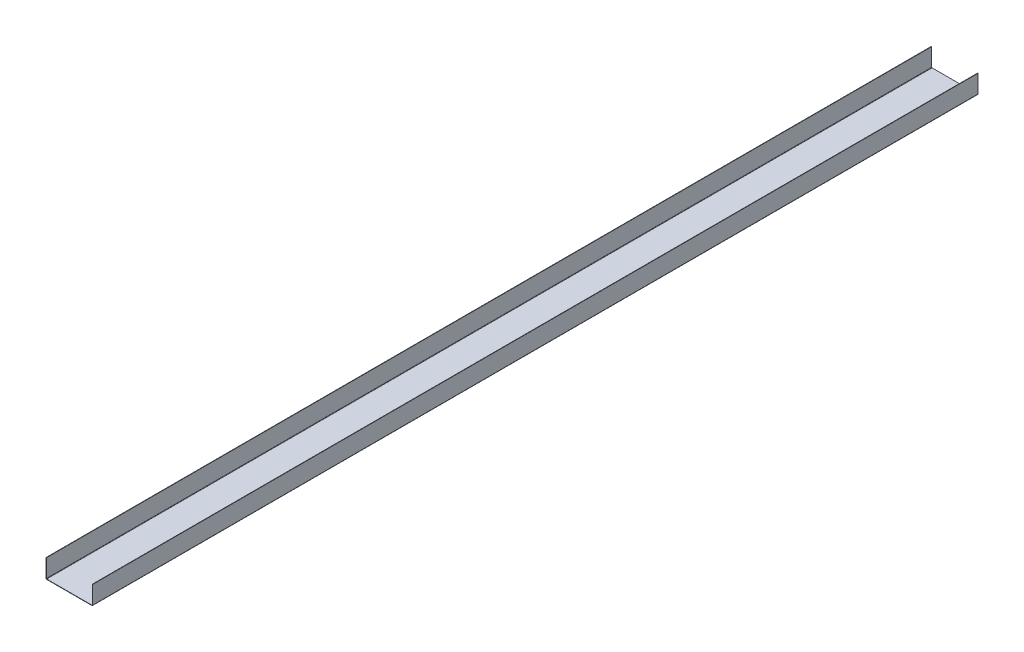
ISO-10303-21;
HEADER;
FILE_DESCRIPTION(('STEP AP214'),'2;1');
FILE_NAME('part.step','',(''),(''),'','','');
FILE_SCHEMA(('AUTOMOTIVE_DESIGN { 1 0 10303 214 1 1 1 1 }'));
ENDSEC;
DATA;
#1=APPLICATION_CONTEXT('core data for automotive mechanical design processes');
#2=APPLICATION_PROTOCOL_DEFINITION('international standard','automotive_design',2000,#1);
#3=PRODUCT_CONTEXT('',#1,'mechanical');
#4=PRODUCT('Part','Part','',(#3));
#5=PRODUCT_RELATED_PRODUCT_CATEGORY('part','',(#4));
#6=PRODUCT_DEFINITION_FORMATION('','',#4);
#7=PRODUCT_DEFINITION_CONTEXT('part definition',#1,'design');
#8=PRODUCT_DEFINITION('design','',#6,#7);
#9=PRODUCT_DEFINITION_SHAPE('','',#8);
#10=(LENGTH_UNIT() NAMED_UNIT(*) SI_UNIT(.MILLI.,.METRE.));
#11=(NAMED_UNIT(*) PLANE_ANGLE_UNIT() SI_UNIT($,.RADIAN.));
#12=(NAMED_UNIT(*) SI_UNIT($,.STERADIAN.) SOLID_ANGLE_UNIT());
#13=UNCERTAINTY_MEASURE_WITH_UNIT(LENGTH_MEASURE(1.E-05),#10,'distance_accuracy_value','');
#14=(GEOMETRIC_REPRESENTATION_CONTEXT(3) GLOBAL_UNCERTAINTY_ASSIGNED_CONTEXT((#13)) GLOBAL_UNIT_ASSIGNED_CONTEXT((#10,
#11,#12)) REPRESENTATION_CONTEXT('',''));
#15=CARTESIAN_POINT('',(0.,0.,0.));
#16=DIRECTION('',(0.,0.,1.));
#17=DIRECTION('',(1.,0.,0.));
#18=AXIS2_PLACEMENT_3D('',#15,#16,#17);
#19=CARTESIAN_POINT('',(-50.,1.5,1900.));
#20=DIRECTION('',(0.,0.,1.));
#21=DIRECTION('',(1.,0.,0.));
#22=AXIS2_PLACEMENT_3D('',#19,#20,#21);
#23=PLANE('',#22);
#24=DIRECTION('',(1.,0.,0.));
#25=VECTOR('',#24,1.);
#26=CARTESIAN_POINT('',(-50.,1.5,1900.));
#27=LINE('',#26,#25);
#28=CARTESIAN_POINT('',(-50.,1.5,1900.));
#29=VERTEX_POINT('',#28);
#30=CARTESIAN_POINT('',(-49.25,1.5,1900.));
#31=VERTEX_POINT('',#30);
#32=EDGE_CURVE('E11',#29,#31,#27,.T.);
#33=ORIENTED_EDGE('',*,*,#32,.F.);
#34=CARTESIAN_POINT('',(-48.5,1.5,1900.));
#35=DIRECTION('',(0.,0.,-1.));
#36=DIRECTION('',(-1.,0.,0.));
#37=AXIS2_PLACEMENT_3D('',#34,#35,#36);
#38=CIRCLE('',#37,1.5);
#39=CARTESIAN_POINT('',(-48.5,0.,1900.));
#40=VERTEX_POINT('',#39);
#41=EDGE_CURVE('E149',#29,#40,#38,.F.);
#42=ORIENTED_EDGE('',*,*,#41,.T.);
#43=DIRECTION('',(0.,-1.,0.));
#44=VECTOR('',#43,1.);
#45=CARTESIAN_POINT('',(-48.5,0.75,1900.));
#46=LINE('',#45,#44);
#47=CARTESIAN_POINT('',(-48.5,0.75,1900.));
#48=VERTEX_POINT('',#47);
#49=EDGE_CURVE('E47',#48,#40,#46,.T.);
#50=ORIENTED_EDGE('',*,*,#49,.F.);
#51=CARTESIAN_POINT('',(-48.5,1.5,1900.));
#52=DIRECTION('',(0.,0.,1.));
#53=DIRECTION('',(1.,0.,0.));
#54=AXIS2_PLACEMENT_3D('',#51,#52,#53);
#55=CIRCLE('',#54,0.75);
#56=EDGE_CURVE('E243',#31,#48,#55,.T.);
#57=ORIENTED_EDGE('',*,*,#56,.F.);
#58=EDGE_LOOP('',(#33,#42,#50,#57));
#59=FACE_BOUND('',#58,.T.);
#60=ADVANCED_FACE('F39',(#59),#23,.T.);
#61=CARTESIAN_POINT('',(-48.5,0.75,1900.));
#62=DIRECTION('',(0.,0.,1.));
#63=DIRECTION('',(1.,0.,0.));
#64=AXIS2_PLACEMENT_3D('',#61,#62,#63);
#65=PLANE('',#64);
#66=DIRECTION('',(0.,-1.,0.));
#67=VECTOR('',#66,1.);
#68=CARTESIAN_POINT('',(-50.,40.,1900.));
#69=LINE('',#68,#67);
#70=CARTESIAN_POINT('',(-50.,40.,1900.));
#71=VERTEX_POINT('',#70);
#72=EDGE_CURVE('E154',#71,#29,#69,.T.);
#73=ORIENTED_EDGE('',*,*,#72,.T.);
#74=ORIENTED_EDGE('',*,*,#32,.T.);
#75=DIRECTION('',(0.,-1.,0.));
#76=VECTOR('',#75,1.);
#77=CARTESIAN_POINT('',(-49.25,40.,1900.));
#78=LINE('',#77,#76);
#79=CARTESIAN_POINT('',(-49.25,40.,1900.));
#80=VERTEX_POINT('',#79);
#81=EDGE_CURVE('E256',#80,#31,#78,.T.);
#82=ORIENTED_EDGE('',*,*,#81,.F.);
#83=DIRECTION('',(1.,0.,0.));
#84=VECTOR('',#83,1.);
#85=CARTESIAN_POINT('',(-50.,40.,1900.));
#86=LINE('',#85,#84);
#87=EDGE_CURVE('E258',#71,#80,#86,.T.);
#88=ORIENTED_EDGE('',*,*,#87,.F.);
#89=EDGE_LOOP('',(#73,#74,#82,#88));
#90=FACE_BOUND('',#89,.T.);
#91=ADVANCED_FACE('F269',(#90),#65,.T.);
#92=CARTESIAN_POINT('',(-48.5,0.,0.));
#93=DIRECTION('',(0.,0.,-1.));
#94=DIRECTION('',(-1.,0.,0.));
#95=AXIS2_PLACEMENT_3D('',#92,#93,#94);
#96=PLANE('',#95);
#97=DIRECTION('',(0.,1.,0.));
#98=VECTOR('',#97,1.);
#99=CARTESIAN_POINT('',(-48.5,0.,0.));
#100=LINE('',#99,#98);
#101=CARTESIAN_POINT('',(-48.5,0.,0.));
#102=VERTEX_POINT('',#101);
#103=CARTESIAN_POINT('',(-48.5,0.75,0.));
#104=VERTEX_POINT('',#103);
#105=EDGE_CURVE('E147',#102,#104,#100,.T.);
#106=ORIENTED_EDGE('',*,*,#105,.F.);
#107=CARTESIAN_POINT('',(-48.5,1.5,0.));
#108=DIRECTION('',(0.,0.,-1.));
#109=DIRECTION('',(-1.,0.,0.));
#110=AXIS2_PLACEMENT_3D('',#107,#108,#109);
#111=CIRCLE('',#110,1.5);
#112=CARTESIAN_POINT('',(-50.,1.5,0.));
#113=VERTEX_POINT('',#112);
#114=EDGE_CURVE('E161',#113,#102,#111,.F.);
#115=ORIENTED_EDGE('',*,*,#114,.F.);
#116=DIRECTION('',(-1.,0.,0.));
#117=VECTOR('',#116,1.);
#118=CARTESIAN_POINT('',(-49.25,1.5,0.));
#119=LINE('',#118,#117);
#120=CARTESIAN_POINT('',(-49.25,1.5,0.));
#121=VERTEX_POINT('',#120);
#122=EDGE_CURVE('E234',#121,#113,#119,.T.);
#123=ORIENTED_EDGE('',*,*,#122,.F.);
#124=CARTESIAN_POINT('',(-48.5,1.5,0.));
#125=DIRECTION('',(0.,0.,1.));
#126=DIRECTION('',(1.,0.,0.));
#127=AXIS2_PLACEMENT_3D('',#124,#125,#126);
#128=CIRCLE('',#127,0.75);
#129=EDGE_CURVE('E188',#121,#104,#128,.T.);
#130=ORIENTED_EDGE('',*,*,#129,.T.);
#131=EDGE_LOOP('',(#106,#115,#123,#130));
#132=FACE_BOUND('',#131,.T.);
#133=ADVANCED_FACE('F248',(#132),#96,.T.);
#134=CARTESIAN_POINT('',(-49.25,1.5,0.));
#135=DIRECTION('',(0.,0.,-1.));
#136=DIRECTION('',(-1.,0.,0.));
#137=AXIS2_PLACEMENT_3D('',#134,#135,#136);
#138=PLANE('',#137);
#139=DIRECTION('',(1.,0.,0.));
#140=VECTOR('',#139,1.);
#141=CARTESIAN_POINT('',(-50.,0.,0.));
#142=LINE('',#141,#140);
#143=CARTESIAN_POINT('',(48.5,0.,0.));
#144=VERTEX_POINT('',#143);
#145=EDGE_CURVE('E201',#102,#144,#142,.T.);
#146=ORIENTED_EDGE('',*,*,#145,.F.);
#147=ORIENTED_EDGE('',*,*,#105,.T.);
#148=DIRECTION('',(1.,0.,0.));
#149=VECTOR('',#148,1.);
#150=CARTESIAN_POINT('',(-50.,0.75,0.));
#151=LINE('',#150,#149);
#152=CARTESIAN_POINT('',(48.5,0.750000000000018,0.));
#153=VERTEX_POINT('',#152);
#154=EDGE_CURVE('E186',#104,#153,#151,.T.);
#155=ORIENTED_EDGE('',*,*,#154,.T.);
#156=DIRECTION('',(0.,-1.,0.));
#157=VECTOR('',#156,1.);
#158=CARTESIAN_POINT('',(48.5,0.750000000000018,0.));
#159=LINE('',#158,#157);
#160=EDGE_CURVE('E96',#153,#144,#159,.T.);
#161=ORIENTED_EDGE('',*,*,#160,.T.);
#162=EDGE_LOOP('',(#146,#147,#155,#161));
#163=FACE_BOUND('',#162,.T.);
#164=ADVANCED_FACE('F236',(#163),#138,.T.);
#165=CARTESIAN_POINT('',(48.5,0.,1900.));
#166=DIRECTION('',(0.,0.,1.));
#167=DIRECTION('',(1.,0.,0.));
#168=AXIS2_PLACEMENT_3D('',#165,#166,#167);
#169=PLANE('',#168);
#170=DIRECTION('',(0.,1.,0.));
#171=VECTOR('',#170,1.);
#172=CARTESIAN_POINT('',(48.5,0.,1900.));
#173=LINE('',#172,#171);
#174=CARTESIAN_POINT('',(48.5,0.,1900.));
#175=VERTEX_POINT('',#174);
#176=CARTESIAN_POINT('',(48.5,0.750000000000018,1900.));
#177=VERTEX_POINT('',#176);
#178=EDGE_CURVE('E232',#175,#177,#173,.T.);
#179=ORIENTED_EDGE('',*,*,#178,.F.);
#180=CARTESIAN_POINT('',(48.5,1.50000000000002,1900.));
#181=DIRECTION('',(0.,0.,-1.));
#182=DIRECTION('',(-1.,0.,0.));
#183=AXIS2_PLACEMENT_3D('',#180,#181,#182);
#184=CIRCLE('',#183,1.5);
#185=CARTESIAN_POINT('',(50.,1.50000000000002,1900.));
#186=VERTEX_POINT('',#185);
#187=EDGE_CURVE('E169',#175,#186,#184,.F.);
#188=ORIENTED_EDGE('',*,*,#187,.T.);
#189=DIRECTION('',(1.,0.,0.));
#190=VECTOR('',#189,1.);
#191=CARTESIAN_POINT('',(49.25,1.50000000000002,1900.));
#192=LINE('',#191,#190);
#193=CARTESIAN_POINT('',(49.25,1.50000000000002,1900.));
#194=VERTEX_POINT('',#193);
#195=EDGE_CURVE('E55',#194,#186,#192,.T.);
#196=ORIENTED_EDGE('',*,*,#195,.F.);
#197=CARTESIAN_POINT('',(48.5,1.50000000000002,1900.));
#198=DIRECTION('',(0.,0.,1.));
#199=DIRECTION('',(1.,0.,0.));
#200=AXIS2_PLACEMENT_3D('',#197,#198,#199);
#201=CIRCLE('',#200,0.75);
#202=EDGE_CURVE('E260',#177,#194,#201,.T.);
#203=ORIENTED_EDGE('',*,*,#202,.F.);
#204=EDGE_LOOP('',(#179,#188,#196,#203));
#205=FACE_BOUND('',#204,.T.);
#206=ADVANCED_FACE('F295',(#205),#169,.T.);
#207=CARTESIAN_POINT('',(49.25,1.50000000000002,1900.));
#208=DIRECTION('',(0.,0.,1.));
#209=DIRECTION('',(1.,0.,0.));
#210=AXIS2_PLACEMENT_3D('',#207,#208,#209);
#211=PLANE('',#210);
#212=DIRECTION('',(1.,0.,0.));
#213=VECTOR('',#212,1.);
#214=CARTESIAN_POINT('',(-50.,0.,1900.));
#215=LINE('',#214,#213);
#216=EDGE_CURVE('E139',#40,#175,#215,.T.);
#217=ORIENTED_EDGE('',*,*,#216,.T.);
#218=ORIENTED_EDGE('',*,*,#178,.T.);
#219=DIRECTION('',(1.,0.,0.));
#220=VECTOR('',#219,1.);
#221=CARTESIAN_POINT('',(-50.,0.75,1900.));
#222=LINE('',#221,#220);
#223=EDGE_CURVE('E142',#48,#177,#222,.T.);
#224=ORIENTED_EDGE('',*,*,#223,.F.);
#225=ORIENTED_EDGE('',*,*,#49,.T.);
#226=EDGE_LOOP('',(#217,#218,#224,#225));
#227=FACE_BOUND('',#226,.T.);
#228=ADVANCED_FACE('F137',(#227),#211,.T.);
#229=CARTESIAN_POINT('',(50.,1.50000000000002,0.));
#230=DIRECTION('',(0.,0.,-1.));
#231=DIRECTION('',(-1.,0.,0.));
#232=AXIS2_PLACEMENT_3D('',#229,#230,#231);
#233=PLANE('',#232);
#234=DIRECTION('',(-1.,0.,0.));
#235=VECTOR('',#234,1.);
#236=CARTESIAN_POINT('',(50.,1.50000000000002,0.));
#237=LINE('',#236,#235);
#238=CARTESIAN_POINT('',(50.,1.50000000000002,0.));
#239=VERTEX_POINT('',#238);
#240=CARTESIAN_POINT('',(49.25,1.50000000000002,0.));
#241=VERTEX_POINT('',#240);
#242=EDGE_CURVE('E103',#239,#241,#237,.T.);
#243=ORIENTED_EDGE('',*,*,#242,.F.);
#244=CARTESIAN_POINT('',(48.5,1.50000000000002,0.));
#245=DIRECTION('',(0.,0.,-1.));
#246=DIRECTION('',(-1.,0.,0.));
#247=AXIS2_PLACEMENT_3D('',#244,#245,#246);
#248=CIRCLE('',#247,1.5);
#249=EDGE_CURVE('E203',#144,#239,#248,.F.);
#250=ORIENTED_EDGE('',*,*,#249,.F.);
#251=ORIENTED_EDGE('',*,*,#160,.F.);
#252=CARTESIAN_POINT('',(48.5,1.50000000000002,0.));
#253=DIRECTION('',(0.,0.,1.));
#254=DIRECTION('',(1.,0.,0.));
#255=AXIS2_PLACEMENT_3D('',#252,#253,#254);
#256=CIRCLE('',#255,0.75);
#257=EDGE_CURVE('E184',#153,#241,#256,.T.);
#258=ORIENTED_EDGE('',*,*,#257,.T.);
#259=EDGE_LOOP('',(#243,#250,#251,#258));
#260=FACE_BOUND('',#259,.T.);
#261=ADVANCED_FACE('F301',(#260),#233,.T.);
#262=CARTESIAN_POINT('',(48.5,0.750000000000018,0.));
#263=DIRECTION('',(0.,0.,-1.));
#264=DIRECTION('',(-1.,0.,0.));
#265=AXIS2_PLACEMENT_3D('',#262,#263,#264);
#266=PLANE('',#265);
#267=DIRECTION('',(0.,1.,0.));
#268=VECTOR('',#267,1.);
#269=CARTESIAN_POINT('',(50.,0.,0.));
#270=LINE('',#269,#268);
#271=CARTESIAN_POINT('',(50.,40.,0.));
#272=VERTEX_POINT('',#271);
#273=EDGE_CURVE('E175',#239,#272,#270,.T.);
#274=ORIENTED_EDGE('',*,*,#273,.F.);
#275=ORIENTED_EDGE('',*,*,#242,.T.);
#276=DIRECTION('',(0.,1.,0.));
#277=VECTOR('',#276,1.);
#278=CARTESIAN_POINT('',(49.25,0.,0.));
#279=LINE('',#278,#277);
#280=CARTESIAN_POINT('',(49.25,40.,0.));
#281=VERTEX_POINT('',#280);
#282=EDGE_CURVE('E181',#241,#281,#279,.T.);
#283=ORIENTED_EDGE('',*,*,#282,.T.);
#284=DIRECTION('',(1.,0.,0.));
#285=VECTOR('',#284,1.);
#286=CARTESIAN_POINT('',(49.25,40.,0.));
#287=LINE('',#286,#285);
#288=EDGE_CURVE('E178',#281,#272,#287,.T.);
#289=ORIENTED_EDGE('',*,*,#288,.T.);
#290=EDGE_LOOP('',(#274,#275,#283,#289));
#291=FACE_BOUND('',#290,.T.);
#292=ADVANCED_FACE('F304',(#291),#266,.T.);
#293=CARTESIAN_POINT('',(50.,0.,1900.));
#294=DIRECTION('',(-1.,0.,0.));
#295=DIRECTION('',(0.,-1.,0.));
#296=AXIS2_PLACEMENT_3D('',#293,#294,#295);
#297=PLANE('',#296);
#298=ORIENTED_EDGE('',*,*,#273,.T.);
#299=DIRECTION('',(0.,0.,-1.));
#300=VECTOR('',#299,1.);
#301=CARTESIAN_POINT('',(50.,40.,1900.));
#302=LINE('',#301,#300);
#303=CARTESIAN_POINT('',(50.,40.,1900.));
#304=VERTEX_POINT('',#303);
#305=EDGE_CURVE('E227',#304,#272,#302,.T.);
#306=ORIENTED_EDGE('',*,*,#305,.F.);
#307=DIRECTION('',(0.,1.,0.));
#308=VECTOR('',#307,1.);
#309=CARTESIAN_POINT('',(50.,0.,1900.));
#310=LINE('',#309,#308);
#311=EDGE_CURVE('E109',#186,#304,#310,.T.);
#312=ORIENTED_EDGE('',*,*,#311,.F.);
#313=DIRECTION('',(0.,0.,-1.));
#314=VECTOR('',#313,1.);
#315=CARTESIAN_POINT('',(50.,1.50000000000002,1900.));
#316=LINE('',#315,#314);
#317=EDGE_CURVE('E171',#186,#239,#316,.T.);
#318=ORIENTED_EDGE('',*,*,#317,.T.);
#319=EDGE_LOOP('',(#298,#306,#312,#318));
#320=FACE_BOUND('',#319,.T.);
#321=ADVANCED_FACE('F307',(#320),#297,.F.);
#322=CARTESIAN_POINT('',(49.25,40.,1900.));
#323=DIRECTION('',(0.,1.,0.));
#324=DIRECTION('',(0.,0.,1.));
#325=AXIS2_PLACEMENT_3D('',#322,#323,#324);
#326=PLANE('',#325);
#327=ORIENTED_EDGE('',*,*,#288,.F.);
#328=DIRECTION('',(0.,0.,-1.));
#329=VECTOR('',#328,1.);
#330=CARTESIAN_POINT('',(49.25,40.,1900.));
#331=LINE('',#330,#329);
#332=CARTESIAN_POINT('',(49.25,40.,1900.));
#333=VERTEX_POINT('',#332);
#334=EDGE_CURVE('E225',#333,#281,#331,.T.);
#335=ORIENTED_EDGE('',*,*,#334,.F.);
#336=DIRECTION('',(1.,0.,0.));
#337=VECTOR('',#336,1.);
#338=CARTESIAN_POINT('',(49.25,40.,1900.));
#339=LINE('',#338,#337);
#340=EDGE_CURVE('E515',#333,#304,#339,.T.);
#341=ORIENTED_EDGE('',*,*,#340,.T.);
#342=ORIENTED_EDGE('',*,*,#305,.T.);
#343=EDGE_LOOP('',(#327,#335,#341,#342));
#344=FACE_BOUND('',#343,.T.);
#345=ADVANCED_FACE('F311',(#344),#326,.T.);
#346=CARTESIAN_POINT('',(49.25,0.,1900.));
#347=DIRECTION('',(-1.,0.,0.));
#348=DIRECTION('',(0.,-1.,0.));
#349=AXIS2_PLACEMENT_3D('',#346,#347,#348);
#350=PLANE('',#349);
#351=ORIENTED_EDGE('',*,*,#282,.F.);
#352=DIRECTION('',(0.,0.,-1.));
#353=VECTOR('',#352,1.);
#354=CARTESIAN_POINT('',(49.25,1.50000000000002,1900.));
#355=LINE('',#354,#353);
#356=EDGE_CURVE('E222',#194,#241,#355,.T.);
#357=ORIENTED_EDGE('',*,*,#356,.F.);
#358=DIRECTION('',(0.,1.,0.));
#359=VECTOR('',#358,1.);
#360=CARTESIAN_POINT('',(49.25,0.,1900.));
#361=LINE('',#360,#359);
#362=EDGE_CURVE('E517',#194,#333,#361,.T.);
#363=ORIENTED_EDGE('',*,*,#362,.T.);
#364=ORIENTED_EDGE('',*,*,#334,.T.);
#365=EDGE_LOOP('',(#351,#357,#363,#364));
#366=FACE_BOUND('',#365,.T.);
#367=ADVANCED_FACE('F315',(#366),#350,.T.);
#368=CARTESIAN_POINT('',(48.5,1.50000000000002,1900.));
#369=DIRECTION('',(0.,0.,-1.));
#370=DIRECTION('',(-1.,0.,0.));
#371=AXIS2_PLACEMENT_3D('',#368,#369,#370);
#372=CYLINDRICAL_SURFACE('',#371,0.75);
#373=ORIENTED_EDGE('',*,*,#257,.F.);
#374=DIRECTION('',(0.,0.,-1.));
#375=VECTOR('',#374,1.);
#376=CARTESIAN_POINT('',(48.5,0.750000000000018,1900.));
#377=LINE('',#376,#375);
#378=EDGE_CURVE('E219',#177,#153,#377,.T.);
#379=ORIENTED_EDGE('',*,*,#378,.F.);
#380=ORIENTED_EDGE('',*,*,#202,.T.);
#381=ORIENTED_EDGE('',*,*,#356,.T.);
#382=EDGE_LOOP('',(#373,#379,#380,#381));
#383=FACE_BOUND('',#382,.T.);
#384=ADVANCED_FACE('F319',(#383),#372,.F.);
#385=CARTESIAN_POINT('',(-50.,0.75,1900.));
#386=DIRECTION('',(0.,1.,0.));
#387=DIRECTION('',(-1.,0.,0.));
#388=AXIS2_PLACEMENT_3D('',#385,#386,#387);
#389=PLANE('',#388);
#390=ORIENTED_EDGE('',*,*,#154,.F.);
#391=DIRECTION('',(0.,0.,-1.));
#392=VECTOR('',#391,1.);
#393=CARTESIAN_POINT('',(-48.5,0.75,1900.));
#394=LINE('',#393,#392);
#395=EDGE_CURVE('E216',#48,#104,#394,.T.);
#396=ORIENTED_EDGE('',*,*,#395,.F.);
#397=ORIENTED_EDGE('',*,*,#223,.T.);
#398=ORIENTED_EDGE('',*,*,#378,.T.);
#399=EDGE_LOOP('',(#390,#396,#397,#398));
#400=FACE_BOUND('',#399,.T.);
#401=ADVANCED_FACE('F245',(#400),#389,.T.);
#402=CARTESIAN_POINT('',(-48.5,1.5,1900.));
#403=DIRECTION('',(0.,0.,-1.));
#404=DIRECTION('',(-1.,0.,0.));
#405=AXIS2_PLACEMENT_3D('',#402,#403,#404);
#406=CYLINDRICAL_SURFACE('',#405,0.75);
#407=ORIENTED_EDGE('',*,*,#129,.F.);
#408=DIRECTION('',(0.,0.,-1.));
#409=VECTOR('',#408,1.);
#410=CARTESIAN_POINT('',(-49.25,1.5,1900.));
#411=LINE('',#410,#409);
#412=EDGE_CURVE('E213',#31,#121,#411,.T.);
#413=ORIENTED_EDGE('',*,*,#412,.F.);
#414=ORIENTED_EDGE('',*,*,#56,.T.);
#415=ORIENTED_EDGE('',*,*,#395,.T.);
#416=EDGE_LOOP('',(#407,#413,#414,#415));
#417=FACE_BOUND('',#416,.T.);
#418=ADVANCED_FACE('F241',(#417),#406,.F.);
#419=CARTESIAN_POINT('',(-49.25,40.,1900.));
#420=DIRECTION('',(1.,0.,0.));
#421=DIRECTION('',(0.,1.,0.));
#422=AXIS2_PLACEMENT_3D('',#419,#420,#421);
#423=PLANE('',#422);
#424=DIRECTION('',(0.,-1.,0.));
#425=VECTOR('',#424,1.);
#426=CARTESIAN_POINT('',(-49.25,40.,0.));
#427=LINE('',#426,#425);
#428=CARTESIAN_POINT('',(-49.25,40.,0.));
#429=VERTEX_POINT('',#428);
#430=EDGE_CURVE('E191',#429,#121,#427,.T.);
#431=ORIENTED_EDGE('',*,*,#430,.F.);
#432=DIRECTION('',(0.,0.,-1.));
#433=VECTOR('',#432,1.);
#434=CARTESIAN_POINT('',(-49.25,40.,1900.));
#435=LINE('',#434,#433);
#436=EDGE_CURVE('E211',#80,#429,#435,.T.);
#437=ORIENTED_EDGE('',*,*,#436,.F.);
#438=ORIENTED_EDGE('',*,*,#81,.T.);
#439=ORIENTED_EDGE('',*,*,#412,.T.);
#440=EDGE_LOOP('',(#431,#437,#438,#439));
#441=FACE_BOUND('',#440,.T.);
#442=ADVANCED_FACE('F254',(#441),#423,.T.);
#443=CARTESIAN_POINT('',(-50.,40.,1900.));
#444=DIRECTION('',(0.,1.,0.));
#445=DIRECTION('',(0.,0.,1.));
#446=AXIS2_PLACEMENT_3D('',#443,#444,#445);
#447=PLANE('',#446);
#448=DIRECTION('',(1.,0.,0.));
#449=VECTOR('',#448,1.);
#450=CARTESIAN_POINT('',(-50.,40.,0.));
#451=LINE('',#450,#449);
#452=CARTESIAN_POINT('',(-50.,40.,0.));
#453=VERTEX_POINT('',#452);
#454=EDGE_CURVE('E194',#453,#429,#451,.T.);
#455=ORIENTED_EDGE('',*,*,#454,.F.);
#456=DIRECTION('',(0.,0.,-1.));
#457=VECTOR('',#456,1.);
#458=CARTESIAN_POINT('',(-50.,40.,1900.));
#459=LINE('',#458,#457);
#460=EDGE_CURVE('E209',#71,#453,#459,.T.);
#461=ORIENTED_EDGE('',*,*,#460,.F.);
#462=ORIENTED_EDGE('',*,*,#87,.T.);
#463=ORIENTED_EDGE('',*,*,#436,.T.);
#464=EDGE_LOOP('',(#455,#461,#462,#463));
#465=FACE_BOUND('',#464,.T.);
#466=ADVANCED_FACE('F275',(#465),#447,.T.);
#467=CARTESIAN_POINT('',(-50.,40.,1900.));
#468=DIRECTION('',(1.,0.,0.));
#469=DIRECTION('',(0.,1.,0.));
#470=AXIS2_PLACEMENT_3D('',#467,#468,#469);
#471=PLANE('',#470);
#472=DIRECTION('',(0.,-1.,0.));
#473=VECTOR('',#472,1.);
#474=CARTESIAN_POINT('',(-50.,40.,0.));
#475=LINE('',#474,#473);
#476=EDGE_CURVE('E197',#453,#113,#475,.T.);
#477=ORIENTED_EDGE('',*,*,#476,.T.);
#478=DIRECTION('',(0.,0.,-1.));
#479=VECTOR('',#478,1.);
#480=CARTESIAN_POINT('',(-50.,1.5,1900.));
#481=LINE('',#480,#479);
#482=EDGE_CURVE('E163',#29,#113,#481,.T.);
#483=ORIENTED_EDGE('',*,*,#482,.F.);
#484=ORIENTED_EDGE('',*,*,#72,.F.);
#485=ORIENTED_EDGE('',*,*,#460,.T.);
#486=EDGE_LOOP('',(#477,#483,#484,#485));
#487=FACE_BOUND('',#486,.T.);
#488=ADVANCED_FACE('F271',(#487),#471,.F.);
#489=CARTESIAN_POINT('',(-48.5,1.5,1900.));
#490=DIRECTION('',(0.,0.,-1.));
#491=DIRECTION('',(-1.,0.,0.));
#492=AXIS2_PLACEMENT_3D('',#489,#490,#491);
#493=CYLINDRICAL_SURFACE('',#492,1.5);
#494=ORIENTED_EDGE('',*,*,#114,.T.);
#495=DIRECTION('',(0.,0.,-1.));
#496=VECTOR('',#495,1.);
#497=CARTESIAN_POINT('',(-48.5,0.,1900.));
#498=LINE('',#497,#496);
#499=EDGE_CURVE('E158',#40,#102,#498,.T.);
#500=ORIENTED_EDGE('',*,*,#499,.F.);
#501=ORIENTED_EDGE('',*,*,#41,.F.);
#502=ORIENTED_EDGE('',*,*,#482,.T.);
#503=EDGE_LOOP('',(#494,#500,#501,#502));
#504=FACE_BOUND('',#503,.T.);
#505=ADVANCED_FACE('F159',(#504),#493,.T.);
#506=CARTESIAN_POINT('',(-50.,0.,1900.));
#507=DIRECTION('',(0.,1.,0.));
#508=DIRECTION('',(-1.,0.,0.));
#509=AXIS2_PLACEMENT_3D('',#506,#507,#508);
#510=PLANE('',#509);
#511=ORIENTED_EDGE('',*,*,#145,.T.);
#512=DIRECTION('',(0.,0.,-1.));
#513=VECTOR('',#512,1.);
#514=CARTESIAN_POINT('',(48.5,0.,1900.));
#515=LINE('',#514,#513);
#516=EDGE_CURVE('E164',#175,#144,#515,.T.);
#517=ORIENTED_EDGE('',*,*,#516,.F.);
#518=ORIENTED_EDGE('',*,*,#216,.F.);
#519=ORIENTED_EDGE('',*,*,#499,.T.);
#520=EDGE_LOOP('',(#511,#517,#518,#519));
#521=FACE_BOUND('',#520,.T.);
#522=ADVANCED_FACE('F166',(#521),#510,.F.);
#523=CARTESIAN_POINT('',(48.5,1.50000000000002,1900.));
#524=DIRECTION('',(0.,0.,-1.));
#525=DIRECTION('',(-1.,0.,0.));
#526=AXIS2_PLACEMENT_3D('',#523,#524,#525);
#527=CYLINDRICAL_SURFACE('',#526,1.5);
#528=ORIENTED_EDGE('',*,*,#249,.T.);
#529=ORIENTED_EDGE('',*,*,#317,.F.);
#530=ORIENTED_EDGE('',*,*,#187,.F.);
#531=ORIENTED_EDGE('',*,*,#516,.T.);
#532=EDGE_LOOP('',(#528,#529,#530,#531));
#533=FACE_BOUND('',#532,.T.);
#534=ADVANCED_FACE('F366',(#533),#527,.T.);
#535=CARTESIAN_POINT('',(48.5,1.50000000000002,1900.));
#536=DIRECTION('',(0.,0.,1.));
#537=DIRECTION('',(1.,0.,0.));
#538=AXIS2_PLACEMENT_3D('',#535,#536,#537);
#539=PLANE('',#538);
#540=ORIENTED_EDGE('',*,*,#311,.T.);
#541=ORIENTED_EDGE('',*,*,#340,.F.);
#542=ORIENTED_EDGE('',*,*,#362,.F.);
#543=ORIENTED_EDGE('',*,*,#195,.T.);
#544=EDGE_LOOP('',(#540,#541,#542,#543));
#545=FACE_BOUND('',#544,.T.);
#546=ADVANCED_FACE('F376',(#545),#539,.T.);
#547=CARTESIAN_POINT('',(48.5,1.50000000000002,0.));
#548=DIRECTION('',(0.,0.,1.));
#549=DIRECTION('',(1.,0.,0.));
#550=AXIS2_PLACEMENT_3D('',#547,#548,#549);
#551=PLANE('',#550);
#552=ORIENTED_EDGE('',*,*,#430,.T.);
#553=ORIENTED_EDGE('',*,*,#122,.T.);
#554=ORIENTED_EDGE('',*,*,#476,.F.);
#555=ORIENTED_EDGE('',*,*,#454,.T.);
#556=EDGE_LOOP('',(#552,#553,#554,#555));
#557=FACE_BOUND('',#556,.T.);
#558=ADVANCED_FACE('F273',(#557),#551,.F.);
#559=CLOSED_SHELL('',(#60,#91,#133,#164,#206,#228,#261,#292,#321,#345,#367,#384,#401,#418,#442,
#466,#488,#505,#522,#534,#546,#558));
#560=MANIFOLD_SOLID_BREP('B2',#559);
#561=ADVANCED_BREP_SHAPE_REPRESENTATION('',(#18,#560),#14);
#562=SHAPE_DEFINITION_REPRESENTATION(#9,#561);
ENDSEC;
END-ISO-10303-21;
